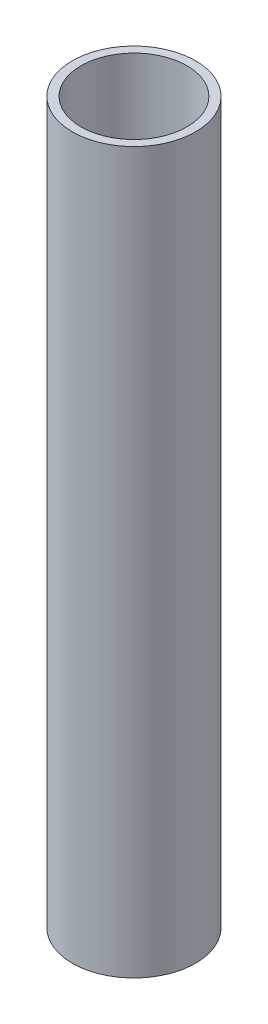
ISO-10303-21;
HEADER;
FILE_DESCRIPTION(('STEP AP214'),'2;1');
FILE_NAME('part.step','',(''),(''),'','','');
FILE_SCHEMA(('AUTOMOTIVE_DESIGN { 1 0 10303 214 1 1 1 1 }'));
ENDSEC;
DATA;
#1=APPLICATION_CONTEXT('core data for automotive mechanical design processes');
#2=APPLICATION_PROTOCOL_DEFINITION('international standard','automotive_design',2000,#1);
#3=PRODUCT_CONTEXT('',#1,'mechanical');
#4=PRODUCT('Part','Part','',(#3));
#5=PRODUCT_RELATED_PRODUCT_CATEGORY('part','',(#4));
#6=PRODUCT_DEFINITION_FORMATION('','',#4);
#7=PRODUCT_DEFINITION_CONTEXT('part definition',#1,'design');
#8=PRODUCT_DEFINITION('design','',#6,#7);
#9=PRODUCT_DEFINITION_SHAPE('','',#8);
#10=(LENGTH_UNIT() NAMED_UNIT(*) SI_UNIT(.MILLI.,.METRE.));
#11=(NAMED_UNIT(*) PLANE_ANGLE_UNIT() SI_UNIT($,.RADIAN.));
#12=(NAMED_UNIT(*) SI_UNIT($,.STERADIAN.) SOLID_ANGLE_UNIT());
#13=UNCERTAINTY_MEASURE_WITH_UNIT(LENGTH_MEASURE(1.E-05),#10,'distance_accuracy_value','');
#14=(GEOMETRIC_REPRESENTATION_CONTEXT(3) GLOBAL_UNCERTAINTY_ASSIGNED_CONTEXT((#13)) GLOBAL_UNIT_ASSIGNED_CONTEXT((#10,
#11,#12)) REPRESENTATION_CONTEXT('',''));
#15=CARTESIAN_POINT('',(0.,0.,0.));
#16=DIRECTION('',(0.,0.,1.));
#17=DIRECTION('',(1.,0.,0.));
#18=AXIS2_PLACEMENT_3D('',#15,#16,#17);
#19=CARTESIAN_POINT('',(0.,123.3,0.));
#20=DIRECTION('',(0.,1.,0.));
#21=DIRECTION('',(0.,0.,1.));
#22=AXIS2_PLACEMENT_3D('',#19,#20,#21);
#23=PLANE('',#22);
#24=CARTESIAN_POINT('',(0.,123.3,0.));
#25=DIRECTION('',(0.,1.,0.));
#26=DIRECTION('',(0.,0.,1.));
#27=AXIS2_PLACEMENT_3D('',#24,#25,#26);
#28=CIRCLE('',#27,21.1);
#29=CARTESIAN_POINT('',(0.,123.3,21.1));
#30=VERTEX_POINT('',#29);
#31=EDGE_CURVE('E12',#30,#30,#28,.T.);
#32=ORIENTED_EDGE('',*,*,#31,.T.);
#33=EDGE_LOOP('',(#32));
#34=FACE_BOUND('',#33,.T.);
#35=CARTESIAN_POINT('',(0.,123.3,0.));
#36=DIRECTION('',(0.,1.,0.));
#37=DIRECTION('',(0.,0.,1.));
#38=AXIS2_PLACEMENT_3D('',#35,#36,#37);
#39=CIRCLE('',#38,18.15);
#40=CARTESIAN_POINT('',(0.,123.3,18.15));
#41=VERTEX_POINT('',#40);
#42=EDGE_CURVE('E53',#41,#41,#39,.T.);
#43=ORIENTED_EDGE('',*,*,#42,.F.);
#44=EDGE_LOOP('',(#43));
#45=FACE_BOUND('',#44,.T.);
#46=ADVANCED_FACE('F42',(#34,#45),#23,.T.);
#47=CARTESIAN_POINT('',(0.,-123.3,0.));
#48=DIRECTION('',(0.,1.,0.));
#49=DIRECTION('',(0.,0.,1.));
#50=AXIS2_PLACEMENT_3D('',#47,#48,#49);
#51=PLANE('',#50);
#52=CARTESIAN_POINT('',(0.,-123.3,0.));
#53=DIRECTION('',(0.,1.,0.));
#54=DIRECTION('',(0.,0.,1.));
#55=AXIS2_PLACEMENT_3D('',#52,#53,#54);
#56=CIRCLE('',#55,21.1);
#57=CARTESIAN_POINT('',(0.,-123.3,21.1));
#58=VERTEX_POINT('',#57);
#59=EDGE_CURVE('E46',#58,#58,#56,.T.);
#60=ORIENTED_EDGE('',*,*,#59,.F.);
#61=EDGE_LOOP('',(#60));
#62=FACE_BOUND('',#61,.T.);
#63=CARTESIAN_POINT('',(0.,-123.3,0.));
#64=DIRECTION('',(0.,1.,0.));
#65=DIRECTION('',(0.,0.,1.));
#66=AXIS2_PLACEMENT_3D('',#63,#64,#65);
#67=CIRCLE('',#66,18.15);
#68=CARTESIAN_POINT('',(0.,-123.3,18.15));
#69=VERTEX_POINT('',#68);
#70=EDGE_CURVE('E55',#69,#69,#67,.T.);
#71=ORIENTED_EDGE('',*,*,#70,.T.);
#72=EDGE_LOOP('',(#71));
#73=FACE_BOUND('',#72,.T.);
#74=ADVANCED_FACE('F65',(#62,#73),#51,.F.);
#75=CARTESIAN_POINT('',(0.,123.3,0.));
#76=DIRECTION('',(0.,-1.,0.));
#77=DIRECTION('',(0.,0.,-1.));
#78=AXIS2_PLACEMENT_3D('',#75,#76,#77);
#79=CYLINDRICAL_SURFACE('',#78,21.1);
#80=ORIENTED_EDGE('',*,*,#31,.F.);
#81=EDGE_LOOP('',(#80));
#82=FACE_BOUND('',#81,.T.);
#83=ORIENTED_EDGE('',*,*,#59,.T.);
#84=EDGE_LOOP('',(#83));
#85=FACE_BOUND('',#84,.T.);
#86=ADVANCED_FACE('F44',(#82,#85),#79,.T.);
#87=CARTESIAN_POINT('',(0.,123.3,0.));
#88=DIRECTION('',(0.,-1.,0.));
#89=DIRECTION('',(0.,0.,-1.));
#90=AXIS2_PLACEMENT_3D('',#87,#88,#89);
#91=CYLINDRICAL_SURFACE('',#90,18.15);
#92=ORIENTED_EDGE('',*,*,#42,.T.);
#93=EDGE_LOOP('',(#92));
#94=FACE_BOUND('',#93,.T.);
#95=ORIENTED_EDGE('',*,*,#70,.F.);
#96=EDGE_LOOP('',(#95));
#97=FACE_BOUND('',#96,.T.);
#98=ADVANCED_FACE('F61',(#94,#97),#91,.F.);
#99=CLOSED_SHELL('',(#46,#74,#86,#98));
#100=MANIFOLD_SOLID_BREP('B2',#99);
#101=ADVANCED_BREP_SHAPE_REPRESENTATION('',(#18,#100),#14);
#102=SHAPE_DEFINITION_REPRESENTATION(#9,#101);
ENDSEC;
END-ISO-10303-21;
